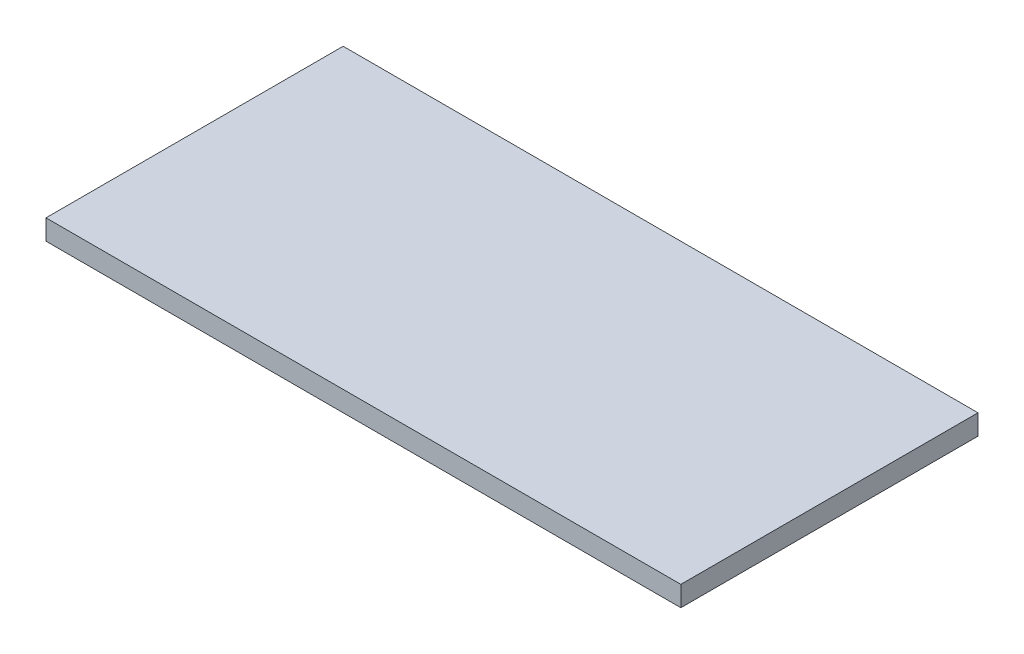
ISO-10303-21;
HEADER;
FILE_DESCRIPTION(('STEP AP214'),'2;1');
FILE_NAME('part.step','',(''),(''),'','','');
FILE_SCHEMA(('AUTOMOTIVE_DESIGN { 1 0 10303 214 1 1 1 1 }'));
ENDSEC;
DATA;
#1=APPLICATION_CONTEXT('core data for automotive mechanical design processes');
#2=APPLICATION_PROTOCOL_DEFINITION('international standard','automotive_design',2000,#1);
#3=PRODUCT_CONTEXT('',#1,'mechanical');
#4=PRODUCT('Part','Part','',(#3));
#5=PRODUCT_RELATED_PRODUCT_CATEGORY('part','',(#4));
#6=PRODUCT_DEFINITION_FORMATION('','',#4);
#7=PRODUCT_DEFINITION_CONTEXT('part definition',#1,'design');
#8=PRODUCT_DEFINITION('design','',#6,#7);
#9=PRODUCT_DEFINITION_SHAPE('','',#8);
#10=(LENGTH_UNIT() NAMED_UNIT(*) SI_UNIT(.MILLI.,.METRE.));
#11=(NAMED_UNIT(*) PLANE_ANGLE_UNIT() SI_UNIT($,.RADIAN.));
#12=(NAMED_UNIT(*) SI_UNIT($,.STERADIAN.) SOLID_ANGLE_UNIT());
#13=UNCERTAINTY_MEASURE_WITH_UNIT(LENGTH_MEASURE(1.E-05),#10,'distance_accuracy_value','');
#14=(GEOMETRIC_REPRESENTATION_CONTEXT(3) GLOBAL_UNCERTAINTY_ASSIGNED_CONTEXT((#13)) GLOBAL_UNIT_ASSIGNED_CONTEXT((#10,
#11,#12)) REPRESENTATION_CONTEXT('',''));
#15=CARTESIAN_POINT('',(0.,0.,0.));
#16=DIRECTION('',(0.,0.,1.));
#17=DIRECTION('',(1.,0.,0.));
#18=AXIS2_PLACEMENT_3D('',#15,#16,#17);
#19=CARTESIAN_POINT('',(0.,6.,0.));
#20=DIRECTION('',(1.,0.,0.));
#21=DIRECTION('',(0.,0.,-1.));
#22=AXIS2_PLACEMENT_3D('',#19,#20,#21);
#23=PLANE('',#22);
#24=DIRECTION('',(0.,0.,1.));
#25=VECTOR('',#24,1.);
#26=CARTESIAN_POINT('',(0.,0.,0.));
#27=LINE('',#26,#25);
#28=CARTESIAN_POINT('',(0.,0.,-88.));
#29=VERTEX_POINT('',#28);
#30=CARTESIAN_POINT('',(0.,0.,0.));
#31=VERTEX_POINT('',#30);
#32=EDGE_CURVE('E95',#29,#31,#27,.T.);
#33=ORIENTED_EDGE('',*,*,#32,.T.);
#34=DIRECTION('',(0.,-1.,0.));
#35=VECTOR('',#34,1.);
#36=CARTESIAN_POINT('',(0.,6.,0.));
#37=LINE('',#36,#35);
#38=CARTESIAN_POINT('',(0.,6.,0.));
#39=VERTEX_POINT('',#38);
#40=EDGE_CURVE('E11',#39,#31,#37,.T.);
#41=ORIENTED_EDGE('',*,*,#40,.F.);
#42=DIRECTION('',(0.,0.,1.));
#43=VECTOR('',#42,1.);
#44=CARTESIAN_POINT('',(0.,6.,0.));
#45=LINE('',#44,#43);
#46=CARTESIAN_POINT('',(0.,6.,-88.));
#47=VERTEX_POINT('',#46);
#48=EDGE_CURVE('E83',#47,#39,#45,.T.);
#49=ORIENTED_EDGE('',*,*,#48,.F.);
#50=DIRECTION('',(0.,-1.,0.));
#51=VECTOR('',#50,1.);
#52=CARTESIAN_POINT('',(0.,6.,-88.));
#53=LINE('',#52,#51);
#54=EDGE_CURVE('E91',#47,#29,#53,.T.);
#55=ORIENTED_EDGE('',*,*,#54,.T.);
#56=EDGE_LOOP('',(#33,#41,#49,#55));
#57=FACE_BOUND('',#56,.T.);
#58=ADVANCED_FACE('F32',(#57),#23,.F.);
#59=CARTESIAN_POINT('',(0.,6.,0.));
#60=DIRECTION('',(0.,0.,-1.));
#61=DIRECTION('',(-1.,0.,0.));
#62=AXIS2_PLACEMENT_3D('',#59,#60,#61);
#63=PLANE('',#62);
#64=DIRECTION('',(1.,0.,0.));
#65=VECTOR('',#64,1.);
#66=CARTESIAN_POINT('',(0.,0.,0.));
#67=LINE('',#66,#65);
#68=CARTESIAN_POINT('',(188.,0.,0.));
#69=VERTEX_POINT('',#68);
#70=EDGE_CURVE('E87',#31,#69,#67,.T.);
#71=ORIENTED_EDGE('',*,*,#70,.T.);
#72=DIRECTION('',(0.,-1.,0.));
#73=VECTOR('',#72,1.);
#74=CARTESIAN_POINT('',(188.,6.,0.));
#75=LINE('',#74,#73);
#76=CARTESIAN_POINT('',(188.,6.,0.));
#77=VERTEX_POINT('',#76);
#78=EDGE_CURVE('E40',#77,#69,#75,.T.);
#79=ORIENTED_EDGE('',*,*,#78,.F.);
#80=DIRECTION('',(1.,0.,0.));
#81=VECTOR('',#80,1.);
#82=CARTESIAN_POINT('',(0.,6.,0.));
#83=LINE('',#82,#81);
#84=EDGE_CURVE('E78',#39,#77,#83,.T.);
#85=ORIENTED_EDGE('',*,*,#84,.F.);
#86=ORIENTED_EDGE('',*,*,#40,.T.);
#87=EDGE_LOOP('',(#71,#79,#85,#86));
#88=FACE_BOUND('',#87,.T.);
#89=ADVANCED_FACE('F86',(#88),#63,.F.);
#90=CARTESIAN_POINT('',(188.,6.,0.));
#91=DIRECTION('',(-1.,0.,0.));
#92=DIRECTION('',(0.,0.,1.));
#93=AXIS2_PLACEMENT_3D('',#90,#91,#92);
#94=PLANE('',#93);
#95=DIRECTION('',(0.,0.,-1.));
#96=VECTOR('',#95,1.);
#97=CARTESIAN_POINT('',(188.,0.,0.));
#98=LINE('',#97,#96);
#99=CARTESIAN_POINT('',(188.,0.,-88.));
#100=VERTEX_POINT('',#99);
#101=EDGE_CURVE('E65',#69,#100,#98,.T.);
#102=ORIENTED_EDGE('',*,*,#101,.T.);
#103=DIRECTION('',(0.,-1.,0.));
#104=VECTOR('',#103,1.);
#105=CARTESIAN_POINT('',(188.,6.,-88.));
#106=LINE('',#105,#104);
#107=CARTESIAN_POINT('',(188.,6.,-88.));
#108=VERTEX_POINT('',#107);
#109=EDGE_CURVE('E88',#108,#100,#106,.T.);
#110=ORIENTED_EDGE('',*,*,#109,.F.);
#111=DIRECTION('',(0.,0.,-1.));
#112=VECTOR('',#111,1.);
#113=CARTESIAN_POINT('',(188.,6.,0.));
#114=LINE('',#113,#112);
#115=EDGE_CURVE('E81',#77,#108,#114,.T.);
#116=ORIENTED_EDGE('',*,*,#115,.F.);
#117=ORIENTED_EDGE('',*,*,#78,.T.);
#118=EDGE_LOOP('',(#102,#110,#116,#117));
#119=FACE_BOUND('',#118,.T.);
#120=ADVANCED_FACE('F89',(#119),#94,.F.);
#121=CARTESIAN_POINT('',(0.,6.,-88.));
#122=DIRECTION('',(0.,0.,1.));
#123=DIRECTION('',(1.,0.,0.));
#124=AXIS2_PLACEMENT_3D('',#121,#122,#123);
#125=PLANE('',#124);
#126=DIRECTION('',(-1.,0.,0.));
#127=VECTOR('',#126,1.);
#128=CARTESIAN_POINT('',(0.,0.,-88.));
#129=LINE('',#128,#127);
#130=EDGE_CURVE('E71',#100,#29,#129,.T.);
#131=ORIENTED_EDGE('',*,*,#130,.T.);
#132=ORIENTED_EDGE('',*,*,#54,.F.);
#133=DIRECTION('',(-1.,0.,0.));
#134=VECTOR('',#133,1.);
#135=CARTESIAN_POINT('',(0.,6.,-88.));
#136=LINE('',#135,#134);
#137=EDGE_CURVE('E48',#108,#47,#136,.T.);
#138=ORIENTED_EDGE('',*,*,#137,.F.);
#139=ORIENTED_EDGE('',*,*,#109,.T.);
#140=EDGE_LOOP('',(#131,#132,#138,#139));
#141=FACE_BOUND('',#140,.T.);
#142=ADVANCED_FACE('F102',(#141),#125,.F.);
#143=CARTESIAN_POINT('',(0.,6.,0.));
#144=DIRECTION('',(0.,-1.,0.));
#145=DIRECTION('',(0.,0.,-1.));
#146=AXIS2_PLACEMENT_3D('',#143,#144,#145);
#147=PLANE('',#146);
#148=ORIENTED_EDGE('',*,*,#48,.T.);
#149=ORIENTED_EDGE('',*,*,#84,.T.);
#150=ORIENTED_EDGE('',*,*,#115,.T.);
#151=ORIENTED_EDGE('',*,*,#137,.T.);
#152=EDGE_LOOP('',(#148,#149,#150,#151));
#153=FACE_BOUND('',#152,.T.);
#154=ADVANCED_FACE('F79',(#153),#147,.F.);
#155=CARTESIAN_POINT('',(0.,0.,0.));
#156=DIRECTION('',(0.,-1.,0.));
#157=DIRECTION('',(0.,0.,-1.));
#158=AXIS2_PLACEMENT_3D('',#155,#156,#157);
#159=PLANE('',#158);
#160=ORIENTED_EDGE('',*,*,#32,.F.);
#161=ORIENTED_EDGE('',*,*,#130,.F.);
#162=ORIENTED_EDGE('',*,*,#101,.F.);
#163=ORIENTED_EDGE('',*,*,#70,.F.);
#164=EDGE_LOOP('',(#160,#161,#162,#163));
#165=FACE_BOUND('',#164,.T.);
#166=ADVANCED_FACE('F105',(#165),#159,.T.);
#167=CLOSED_SHELL('',(#58,#89,#120,#142,#154,#166));
#168=MANIFOLD_SOLID_BREP('B2',#167);
#169=ADVANCED_BREP_SHAPE_REPRESENTATION('',(#18,#168),#14);
#170=SHAPE_DEFINITION_REPRESENTATION(#9,#169);
ENDSEC;
END-ISO-10303-21;
